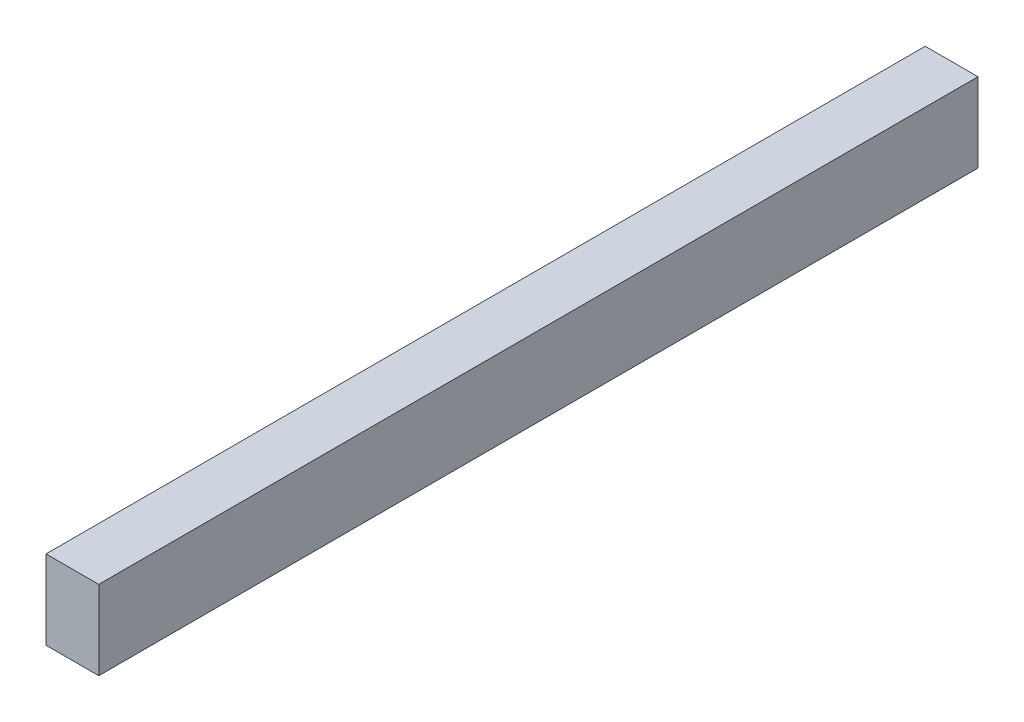
ISO-10303-21;
HEADER;
FILE_DESCRIPTION(('STEP AP214'),'2;1');
FILE_NAME('part.step','',(''),(''),'','','');
FILE_SCHEMA(('AUTOMOTIVE_DESIGN { 1 0 10303 214 1 1 1 1 }'));
ENDSEC;
DATA;
#1=APPLICATION_CONTEXT('core data for automotive mechanical design processes');
#2=APPLICATION_PROTOCOL_DEFINITION('international standard','automotive_design',2000,#1);
#3=PRODUCT_CONTEXT('',#1,'mechanical');
#4=PRODUCT('Part','Part','',(#3));
#5=PRODUCT_RELATED_PRODUCT_CATEGORY('part','',(#4));
#6=PRODUCT_DEFINITION_FORMATION('','',#4);
#7=PRODUCT_DEFINITION_CONTEXT('part definition',#1,'design');
#8=PRODUCT_DEFINITION('design','',#6,#7);
#9=PRODUCT_DEFINITION_SHAPE('','',#8);
#10=(LENGTH_UNIT() NAMED_UNIT(*) SI_UNIT(.MILLI.,.METRE.));
#11=(NAMED_UNIT(*) PLANE_ANGLE_UNIT() SI_UNIT($,.RADIAN.));
#12=(NAMED_UNIT(*) SI_UNIT($,.STERADIAN.) SOLID_ANGLE_UNIT());
#13=UNCERTAINTY_MEASURE_WITH_UNIT(LENGTH_MEASURE(1.E-05),#10,'distance_accuracy_value','');
#14=(GEOMETRIC_REPRESENTATION_CONTEXT(3) GLOBAL_UNCERTAINTY_ASSIGNED_CONTEXT((#13)) GLOBAL_UNIT_ASSIGNED_CONTEXT((#10,
#11,#12)) REPRESENTATION_CONTEXT('',''));
#15=CARTESIAN_POINT('',(0.,0.,0.));
#16=DIRECTION('',(0.,0.,1.));
#17=DIRECTION('',(1.,0.,0.));
#18=AXIS2_PLACEMENT_3D('',#15,#16,#17);
#19=CARTESIAN_POINT('',(-14.9999999999999,2.5,-162.));
#20=DIRECTION('',(0.,-1.,0.));
#21=DIRECTION('',(0.,0.,-1.));
#22=AXIS2_PLACEMENT_3D('',#19,#20,#21);
#23=CYLINDRICAL_SURFACE('',#22,5.);
#24=CARTESIAN_POINT('',(-12.1381823957492,2.5,-157.9));
#25=CARTESIAN_POINT('',(-12.0708784733394,2.42292574536293,-157.946962990163));
#26=CARTESIAN_POINT('',(-12.0067401079309,2.34325099460162,-157.994211563909));
#27=CARTESIAN_POINT('',(-11.8848870401686,2.17867129846748,-158.088226877804));
#28=CARTESIAN_POINT('',(-11.827180845484,2.09375965152346,-158.134992907265));
#29=CARTESIAN_POINT('',(-11.7177022854595,1.91765755359789,-158.227503096089));
#30=CARTESIAN_POINT('',(-11.6660240599136,1.82639596836984,-158.273223858516));
#31=CARTESIAN_POINT('',(-11.5699009779722,1.63875769578585,-158.361500183687));
#32=CARTESIAN_POINT('',(-11.525451955939,1.54238399691458,-158.404057561517));
#33=CARTESIAN_POINT('',(-11.4257121412985,1.29949677162919,-158.502666189578));
#34=CARTESIAN_POINT('',(-11.3746672136965,1.15009199597926,-158.556066470566));
#35=CARTESIAN_POINT('',(-11.2910402071132,0.84193067875827,-158.64627572746));
#36=CARTESIAN_POINT('',(-11.2583663584046,0.683225073430997,-158.683166979249));
#37=CARTESIAN_POINT('',(-11.2245683858408,0.439336075997338,-158.721830827077));
#38=CARTESIAN_POINT('',(-11.2158314471815,0.356461022243041,-158.731950816176));
#39=CARTESIAN_POINT('',(-11.2038233836229,0.189768890287721,-158.745904818135));
#40=CARTESIAN_POINT('',(-11.2005519684299,0.105951862356427,-158.749739164847));
#41=CARTESIAN_POINT('',(-11.199576406082,-0.0617786026982274,-158.750879997259));
#42=CARTESIAN_POINT('',(-11.2018735451402,-0.145692057619546,-158.748184974818));
#43=CARTESIAN_POINT('',(-11.2119639365722,-0.31271632563533,-158.736437962996));
#44=CARTESIAN_POINT('',(-11.2197570788317,-0.395827154776874,-158.727386100976));
#45=CARTESIAN_POINT('',(-11.2478144279695,-0.616952100780136,-158.695178225833));
#46=CARTESIAN_POINT('',(-11.2729641433331,-0.753591517545832,-158.666608640783));
#47=CARTESIAN_POINT('',(-11.3369127674698,-1.02012799081553,-158.596472135212));
#48=CARTESIAN_POINT('',(-11.3757267241793,-1.15001743209591,-158.554890891054));
#49=CARTESIAN_POINT('',(-11.4570490063879,-1.37813218583582,-158.471512973856));
#50=CARTESIAN_POINT('',(-11.4974613822835,-1.47769153298251,-158.431252094998));
#51=CARTESIAN_POINT('',(-11.5857695073914,-1.67164253579375,-158.346677213263));
#52=CARTESIAN_POINT('',(-11.633666965966,-1.76603300437985,-158.302362285527));
#53=CARTESIAN_POINT('',(-11.7366569334218,-1.94979729991697,-158.21115691132));
#54=CARTESIAN_POINT('',(-11.7917647432493,-2.03915986364502,-158.164261114246));
#55=CARTESIAN_POINT('',(-11.908811322132,-2.21257602808473,-158.069320271606));
#56=CARTESIAN_POINT('',(-11.9707490085806,-2.29663046687704,-158.021275409121));
#57=CARTESIAN_POINT('',(-12.170608022567,-2.54574346620994,-157.874181476933));
#58=CARTESIAN_POINT('',(-12.3194727646286,-2.70221218178033,-157.775056725459));
#59=CARTESIAN_POINT('',(-12.6444266964129,-2.98968483302918,-157.585632464764));
#60=CARTESIAN_POINT('',(-12.8204689988031,-3.12073176446786,-157.495318185372));
#61=CARTESIAN_POINT('',(-13.1650326158825,-3.33259121227965,-157.345797898776));
#62=CARTESIAN_POINT('',(-13.3293991535531,-3.41818755898359,-157.283914748017));
#63=CARTESIAN_POINT('',(-13.5871628566423,-3.52883305313963,-157.202913171285));
#64=CARTESIAN_POINT('',(-13.6749803715237,-3.56276403125759,-157.177877585166));
#65=CARTESIAN_POINT('',(-13.8539128417062,-3.62428204201829,-157.132249801536));
#66=CARTESIAN_POINT('',(-13.9450263091907,-3.65187189673112,-157.111655627661));
#67=CARTESIAN_POINT('',(-14.1306900769651,-3.70048372022256,-157.075234105442));
#68=CARTESIAN_POINT('',(-14.2252611747626,-3.72145438251234,-157.059444026884));
#69=CARTESIAN_POINT('',(-14.4164131972862,-3.7561756894332,-157.03323789539));
#70=CARTESIAN_POINT('',(-14.5129931392249,-3.76992978209437,-157.022819276047));
#71=CARTESIAN_POINT('',(-14.7073441781313,-3.78997273768479,-157.007620748027));
#72=CARTESIAN_POINT('',(-14.8051149795696,-3.79626341611731,-157.002839468046));
#73=CARTESIAN_POINT('',(-15.000955847889,-3.8012619360109,-156.999041134974));
#74=CARTESIAN_POINT('',(-15.0990258836063,-3.7999705418649,-157.000023500816));
#75=CARTESIAN_POINT('',(-15.283310971662,-3.79041449339656,-157.007281928578));
#76=CARTESIAN_POINT('',(-15.3695941509106,-3.78296763151737,-157.012937143185));
#77=CARTESIAN_POINT('',(-15.5410708447435,-3.76227519255664,-157.028614720888));
#78=CARTESIAN_POINT('',(-15.626263990541,-3.74902770371374,-157.038638523771));
#79=CARTESIAN_POINT('',(-15.8792794677526,-3.70084620017667,-157.074982475443));
#80=CARTESIAN_POINT('',(-16.0446937323576,-3.65746463381782,-157.107581810855));
#81=CARTESIAN_POINT('',(-16.3679766063841,-3.54940949810275,-157.187829863893));
#82=CARTESIAN_POINT('',(-16.525646099967,-3.48435269726075,-157.235748774848));
#83=CARTESIAN_POINT('',(-16.8276944058551,-3.33584579382316,-157.343258312708));
#84=CARTESIAN_POINT('',(-16.9720710309602,-3.25239267194886,-157.402850855356));
#85=CARTESIAN_POINT('',(-17.2681685400091,-3.05483134332434,-157.540606856881));
#86=CARTESIAN_POINT('',(-17.4173567307083,-2.93795353907155,-157.620215937423));
#87=CARTESIAN_POINT('',(-17.6953260696063,-2.685255049281,-157.785572370335));
#88=CARTESIAN_POINT('',(-17.8240685285669,-2.5493993436402,-157.871330924663));
#89=CARTESIAN_POINT('',(-18.0130145049048,-2.31825092782255,-158.00882748921));
#90=CARTESIAN_POINT('',(-18.0800659148557,-2.22840832812198,-158.060483611962));
#91=CARTESIAN_POINT('',(-18.2063098784865,-2.04259616595674,-158.162532436428));
#92=CARTESIAN_POINT('',(-18.2654997616261,-1.9466245377876,-158.212924704122));
#93=CARTESIAN_POINT('',(-18.3755827874151,-1.74878107052958,-158.310711033198));
#94=CARTESIAN_POINT('',(-18.4264879885828,-1.64691810468708,-158.358109389618));
#95=CARTESIAN_POINT('',(-18.5195700069724,-1.43728006104866,-158.447984972478));
#96=CARTESIAN_POINT('',(-18.5617528012334,-1.32950909621062,-158.490465559981));
#97=CARTESIAN_POINT('',(-18.6462449252602,-1.07998080535424,-158.578087433469));
#98=CARTESIAN_POINT('',(-18.6858658871708,-0.936542962330203,-158.621164709473));
#99=CARTESIAN_POINT('',(-18.7483225665975,-0.642330816214123,-158.690573795202));
#100=CARTESIAN_POINT('',(-18.771198582673,-0.491575063979682,-158.716945787286));
#101=CARTESIAN_POINT('',(-18.7986433065151,-0.184808197398411,-158.748722213304));
#102=CARTESIAN_POINT('',(-18.8030603353442,-0.0287641227969498,-158.753952916153));
#103=CARTESIAN_POINT('',(-18.7927259211736,0.281807958237344,-158.741892171779));
#104=CARTESIAN_POINT('',(-18.7779654014762,0.436335211875412,-158.724590059807));
#105=CARTESIAN_POINT('',(-18.7275583178342,0.758451175363782,-158.667299567864));
#106=CARTESIAN_POINT('',(-18.6894700099054,0.925164167241236,-158.624679974086));
#107=CARTESIAN_POINT('',(-18.5932540571273,1.24783645501811,-158.522442558473));
#108=CARTESIAN_POINT('',(-18.5350286192459,1.40373873064143,-158.46274203461));
#109=CARTESIAN_POINT('',(-18.4286276657215,1.64127180687407,-158.36028546522));
#110=CARTESIAN_POINT('',(-18.3862302088146,1.72698861103695,-158.320712045242));
#111=CARTESIAN_POINT('',(-18.2956006103763,1.89421794281773,-158.239319076243));
#112=CARTESIAN_POINT('',(-18.2473668521068,1.97572929650575,-158.197498906633));
#113=CARTESIAN_POINT('',(-18.1459387370976,2.13348533172392,-158.113180942793));
#114=CARTESIAN_POINT('',(-18.0928144499463,2.20978338493944,-158.070698300345));
#115=CARTESIAN_POINT('',(-17.9812655278952,2.35809932677708,-157.985401373279));
#116=CARTESIAN_POINT('',(-17.9228448592884,2.43012035251745,-157.942587358436));
#117=CARTESIAN_POINT('',(-17.8618176042508,2.5,-157.9));
#118=B_SPLINE_CURVE_WITH_KNOTS('',3,(#24,#25,#26,#27,#28,#29,#30,#31,#32,#33,#34,#35,#36,#37,
#38,#39,#40,#41,#42,#43,#44,#45,#46,#47,#48,#49,#50,#51,#52,#53,#54,#55,#56,#57,#58,#59,#60,#61,
#62,#63,#64,#65,#66,#67,#68,#69,#70,#71,#72,#73,#74,#75,#76,#77,#78,#79,#80,#81,#82,#83,#84,#85,
#86,#87,#88,#89,#90,#91,#92,#93,#94,#95,#96,#97,#98,#99,#100,#101,#102,#103,#104,#105,#106,#107,
#108,#109,#110,#111,#112,#113,#114,#115,#116,#117),.UNSPECIFIED.,.F.,.F.,(4,2,2,2,2,2,2,2,2,2,2,
2,2,2,2,2,2,2,2,2,2,2,2,2,2,2,2,2,2,2,2,2,2,2,2,2,2,2,2,2,2,2,2,2,2,2,4),(0.,0.33769590663108,
0.675833303601331,1.01869368261242,1.36135579200632,1.85966047082445,2.35545331667111,
2.60693059217482,2.85839451038528,3.10991651674096,3.36143348390593,3.78517886221006,
4.2093923633841,4.55317021675882,4.89702669345394,5.24162506898137,5.5861689003856,
6.29596693176579,7.00455381316619,7.58809953314123,7.88004303738517,8.17185636165337,
8.46587898675455,8.7597610015327,9.05357151375104,9.34735240572761,9.60739743788224,
9.86752823984814,10.3873269428743,10.9168522540549,11.4464645378658,12.0609745300507,
12.6766338427089,13.0465871960023,13.4166659018176,13.7862010378291,14.1554821041006,
14.6185439650254,15.0804877192925,15.5462199272906,16.0121726457885,16.5380443639965,
17.0665066196002,17.3767525576476,17.6870846358167,17.9935111301659,18.2997100175654),.UNSPECIFIED.);
#119=CARTESIAN_POINT('',(-16.4798648586949,-3.5,-157.224018425496));
#120=VERTEX_POINT('',#119);
#121=CARTESIAN_POINT('',(-17.8618176042508,2.5,-157.9));
#122=VERTEX_POINT('',#121);
#123=EDGE_CURVE('E347',#120,#122,#118,.T.);
#124=ORIENTED_EDGE('',*,*,#123,.F.);
#125=CARTESIAN_POINT('',(-14.9999999999999,-3.5,-162.));
#126=DIRECTION('',(0.,1.,0.));
#127=DIRECTION('',(0.,0.,1.));
#128=AXIS2_PLACEMENT_3D('',#125,#126,#127);
#129=CIRCLE('',#128,5.);
#130=CARTESIAN_POINT('',(-16.4798648586949,-3.5,-166.775981574504));
#131=VERTEX_POINT('',#130);
#132=EDGE_CURVE('E11',#120,#131,#129,.F.);
#133=ORIENTED_EDGE('',*,*,#132,.T.);
#134=CARTESIAN_POINT('',(-17.8618176042508,2.5,-166.1));
#135=CARTESIAN_POINT('',(-17.9291215266606,2.42292574536292,-166.053037009837));
#136=CARTESIAN_POINT('',(-17.9932598920691,2.34325099460161,-166.005788436091));
#137=CARTESIAN_POINT('',(-18.1151129598314,2.17867129846746,-165.911773122196));
#138=CARTESIAN_POINT('',(-18.172819154516,2.09375965152345,-165.865007092734));
#139=CARTESIAN_POINT('',(-18.2822977145405,1.91765755359788,-165.772496903911));
#140=CARTESIAN_POINT('',(-18.3339759400865,1.82639596836982,-165.726776141484));
#141=CARTESIAN_POINT('',(-18.4300990220278,1.63875769578584,-165.638499816312));
#142=CARTESIAN_POINT('',(-18.474548044061,1.54238399691457,-165.595942438483));
#143=CARTESIAN_POINT('',(-18.5742878587015,1.29949677162918,-165.497333810422));
#144=CARTESIAN_POINT('',(-18.6253327863035,1.15009199597926,-165.443933529433));
#145=CARTESIAN_POINT('',(-18.7089597928868,0.841930678758282,-165.353724272539));
#146=CARTESIAN_POINT('',(-18.7416336415954,0.683225073431015,-165.31683302075));
#147=CARTESIAN_POINT('',(-18.7754316141592,0.439336075997363,-165.278169172923));
#148=CARTESIAN_POINT('',(-18.7841685528185,0.356461022243068,-165.268049183823));
#149=CARTESIAN_POINT('',(-18.7961766163771,0.189768890287752,-165.254095181865));
#150=CARTESIAN_POINT('',(-18.7994480315701,0.105951862356461,-165.250260835152));
#151=CARTESIAN_POINT('',(-18.800423593918,-0.0617786026981866,-165.249120002741));
#152=CARTESIAN_POINT('',(-18.7981264548598,-0.145692057619502,-165.251815025182));
#153=CARTESIAN_POINT('',(-18.7880360634278,-0.312716325635282,-165.263562037004));
#154=CARTESIAN_POINT('',(-18.7802429211683,-0.395827154776824,-165.272613899023));
#155=CARTESIAN_POINT('',(-18.7521855720305,-0.616952100780078,-165.304821774166));
#156=CARTESIAN_POINT('',(-18.7270358566669,-0.753591517545763,-165.333391359217));
#157=CARTESIAN_POINT('',(-18.6630872325302,-1.02012799081546,-165.403527864788));
#158=CARTESIAN_POINT('',(-18.6242732758207,-1.15001743209583,-165.445109108946));
#159=CARTESIAN_POINT('',(-18.5429509936122,-1.37813218583574,-165.528487026143));
#160=CARTESIAN_POINT('',(-18.5025386177165,-1.47769153298242,-165.568747905002));
#161=CARTESIAN_POINT('',(-18.4142304926087,-1.67164253579367,-165.653322786736));
#162=CARTESIAN_POINT('',(-18.366333034034,-1.76603300437977,-165.697637714472));
#163=CARTESIAN_POINT('',(-18.2633430665783,-1.94979729991688,-165.78884308868));
#164=CARTESIAN_POINT('',(-18.2082352567507,-2.03915986364493,-165.835738885753));
#165=CARTESIAN_POINT('',(-18.0911886778681,-2.21257602808463,-165.930679728393));
#166=CARTESIAN_POINT('',(-18.0292509914195,-2.29663046687693,-165.978724590878));
#167=CARTESIAN_POINT('',(-17.829391977433,-2.54574346620985,-166.125818523067));
#168=CARTESIAN_POINT('',(-17.6805272353715,-2.70221218178024,-166.224943274541));
#169=CARTESIAN_POINT('',(-17.3555733035872,-2.9896848330291,-166.414367535235));
#170=CARTESIAN_POINT('',(-17.179531001197,-3.12073176446778,-166.504681814628));
#171=CARTESIAN_POINT('',(-16.8349673841176,-3.33259121227958,-166.654202101224));
#172=CARTESIAN_POINT('',(-16.670600846447,-3.41818755898353,-166.716085251982));
#173=CARTESIAN_POINT('',(-16.4128371433578,-3.52883305313959,-166.797086828714));
#174=CARTESIAN_POINT('',(-16.3250196284764,-3.56276403125755,-166.822122414834));
#175=CARTESIAN_POINT('',(-16.1460871582939,-3.62428204201825,-166.867750198464));
#176=CARTESIAN_POINT('',(-16.0549736908094,-3.65187189673108,-166.888344372339));
#177=CARTESIAN_POINT('',(-15.869309923035,-3.70048372022253,-166.924765894557));
#178=CARTESIAN_POINT('',(-15.7747388252375,-3.72145438251232,-166.940555973116));
#179=CARTESIAN_POINT('',(-15.5835868027139,-3.75617568943318,-166.96676210461));
#180=CARTESIAN_POINT('',(-15.4870068607752,-3.76992978209436,-166.977180723952));
#181=CARTESIAN_POINT('',(-15.2926558218688,-3.78997273768479,-166.992379251973));
#182=CARTESIAN_POINT('',(-15.1948850204305,-3.7962634161173,-166.997160531953));
#183=CARTESIAN_POINT('',(-14.9990441521111,-3.8012619360109,-167.000958865025));
#184=CARTESIAN_POINT('',(-14.9009741163938,-3.7999705418649,-166.999976499184));
#185=CARTESIAN_POINT('',(-14.7166890283381,-3.79041449339656,-166.992718071422));
#186=CARTESIAN_POINT('',(-14.6304058490895,-3.78296763151738,-166.987062856815));
#187=CARTESIAN_POINT('',(-14.4589291552565,-3.76227519255665,-166.971385279112));
#188=CARTESIAN_POINT('',(-14.3737360094591,-3.74902770371375,-166.961361476229));
#189=CARTESIAN_POINT('',(-14.1207205322475,-3.70084620017668,-166.925017524556));
#190=CARTESIAN_POINT('',(-13.9553062676425,-3.65746463381783,-166.892418189144));
#191=CARTESIAN_POINT('',(-13.632023393616,-3.54940949810278,-166.812170136107));
#192=CARTESIAN_POINT('',(-13.4743539000331,-3.48435269726078,-166.764251225151));
#193=CARTESIAN_POINT('',(-13.172305594145,-3.3358457938232,-166.656741687292));
#194=CARTESIAN_POINT('',(-13.0279289690399,-3.2523926719489,-166.597149144644));
#195=CARTESIAN_POINT('',(-12.7318314599909,-3.05483134332438,-166.459393143118));
#196=CARTESIAN_POINT('',(-12.5826432692918,-2.93795353907159,-166.379784062576));
#197=CARTESIAN_POINT('',(-12.3046739303938,-2.68525504928106,-166.214427629665));
#198=CARTESIAN_POINT('',(-12.1759314714331,-2.54939934364026,-166.128669075336));
#199=CARTESIAN_POINT('',(-11.9869854950952,-2.31825092782262,-165.99117251079));
#200=CARTESIAN_POINT('',(-11.9199340851443,-2.22840832812205,-165.939516388037));
#201=CARTESIAN_POINT('',(-11.7936901215135,-2.04259616595683,-165.837467563571));
#202=CARTESIAN_POINT('',(-11.734500238374,-1.94662453778769,-165.787075295878));
#203=CARTESIAN_POINT('',(-11.624417212585,-1.74878107052968,-165.689288966801));
#204=CARTESIAN_POINT('',(-11.5735120114172,-1.64691810468718,-165.641890610382));
#205=CARTESIAN_POINT('',(-11.4804299930277,-1.43728006104876,-165.552015027521));
#206=CARTESIAN_POINT('',(-11.4382471987667,-1.32950909621073,-165.509534440018));
#207=CARTESIAN_POINT('',(-11.3537550747398,-1.07998080535433,-165.421912566531));
#208=CARTESIAN_POINT('',(-11.3141341128293,-0.936542962330287,-165.378835290527));
#209=CARTESIAN_POINT('',(-11.2516774334025,-0.642330816214196,-165.309426204798));
#210=CARTESIAN_POINT('',(-11.228801417327,-0.491575063979752,-165.283054212714));
#211=CARTESIAN_POINT('',(-11.2013566934849,-0.184808197398473,-165.251277786695));
#212=CARTESIAN_POINT('',(-11.1969396646558,-0.0287641227970052,-165.246047083846));
#213=CARTESIAN_POINT('',(-11.2072740788264,0.281807958237304,-165.258107828221));
#214=CARTESIAN_POINT('',(-11.2220345985238,0.436335211875381,-165.275409940192));
#215=CARTESIAN_POINT('',(-11.2724416821658,0.758451175363762,-165.332700432136));
#216=CARTESIAN_POINT('',(-11.3105299900946,0.925164167241218,-165.375320025914));
#217=CARTESIAN_POINT('',(-11.4067459428727,1.24783645501809,-165.477557441527));
#218=CARTESIAN_POINT('',(-11.4649713807541,1.40373873064142,-165.53725796539));
#219=CARTESIAN_POINT('',(-11.5713723342785,1.64127180687405,-165.63971453478));
#220=CARTESIAN_POINT('',(-11.6137697911854,1.72698861103694,-165.679287954758));
#221=CARTESIAN_POINT('',(-11.7043993896237,1.89421794281771,-165.760680923756));
#222=CARTESIAN_POINT('',(-11.7526331478932,1.97572929650573,-165.802501093367));
#223=CARTESIAN_POINT('',(-11.8540612629024,2.13348533172391,-165.886819057207));
#224=CARTESIAN_POINT('',(-11.9071855500536,2.20978338493943,-165.929301699654));
#225=CARTESIAN_POINT('',(-12.0187344721048,2.35809932677707,-166.01459862672));
#226=CARTESIAN_POINT('',(-12.0771551407116,2.43012035251744,-166.057412641564));
#227=CARTESIAN_POINT('',(-12.1381823957492,2.49999999999999,-166.1));
#228=B_SPLINE_CURVE_WITH_KNOTS('',3,(#134,#135,#136,#137,#138,#139,#140,#141,#142,#143,#144,
#145,#146,#147,#148,#149,#150,#151,#152,#153,#154,#155,#156,#157,#158,#159,#160,#161,#162,#163,
#164,#165,#166,#167,#168,#169,#170,#171,#172,#173,#174,#175,#176,#177,#178,#179,#180,#181,#182,
#183,#184,#185,#186,#187,#188,#189,#190,#191,#192,#193,#194,#195,#196,#197,#198,#199,#200,#201,
#202,#203,#204,#205,#206,#207,#208,#209,#210,#211,#212,#213,#214,#215,#216,#217,#218,#219,#220,
#221,#222,#223,#224,#225,#226,#227),.UNSPECIFIED.,.F.,.F.,(4,2,2,2,2,2,2,2,2,2,2,2,2,2,2,2,2,2,
2,2,2,2,2,2,2,2,2,2,2,2,2,2,2,2,2,2,2,2,2,2,2,2,2,2,2,2,4),(0.,0.337695906631104,
0.675833303601369,1.01869368261245,1.36135579200635,1.85966047082447,2.35545331667111,
2.60693059217482,2.85839451038527,3.10991651674094,3.3614334839059,3.78517886221,
4.20939236338405,4.55317021675877,4.89702669345387,5.24162506898127,5.5861689003855,
6.29596693176569,7.00455381316609,7.58809953314116,7.88004303738511,8.17185636165331,
8.46587898675451,8.75976100153266,9.05357151375101,9.34735240572759,9.60739743788223,
9.86752823984813,10.3873269428743,10.9168522540549,11.4464645378657,12.0609745300507,
12.6766338427089,13.0465871960023,13.4166659018175,13.786201037829,14.1554821041005,
14.6185439650253,15.0804877192925,15.5462199272906,16.0121726457885,16.5380443639965,
17.0665066196002,17.3767525576476,17.6870846358167,17.993511130166,18.2997100175654),.UNSPECIFIED.);
#229=CARTESIAN_POINT('',(-17.8618176042508,2.5,-166.1));
#230=VERTEX_POINT('',#229);
#231=EDGE_CURVE('E337',#230,#131,#228,.T.);
#232=ORIENTED_EDGE('',*,*,#231,.F.);
#233=CARTESIAN_POINT('',(-14.9999999999999,2.5,-162.));
#234=DIRECTION('',(0.,-1.,0.));
#235=DIRECTION('',(0.,0.,-1.));
#236=AXIS2_PLACEMENT_3D('',#233,#234,#235);
#237=CIRCLE('',#236,5.);
#238=EDGE_CURVE('E233',#122,#230,#237,.T.);
#239=ORIENTED_EDGE('',*,*,#238,.F.);
#240=EDGE_LOOP('',(#124,#133,#232,#239));
#241=FACE_BOUND('',#240,.T.);
#242=ADVANCED_FACE('F38',(#241),#23,.F.);
#243=CARTESIAN_POINT('',(-15.,0.,-155.));
#244=DIRECTION('',(0.,0.,-1.));
#245=DIRECTION('',(-1.,0.,0.));
#246=AXIS2_PLACEMENT_3D('',#243,#244,#245);
#247=CYLINDRICAL_SURFACE('',#246,3.8);
#248=CARTESIAN_POINT('',(-15.,0.,-250.));
#249=DIRECTION('',(0.,0.,-1.));
#250=DIRECTION('',(-1.,0.,0.));
#251=AXIS2_PLACEMENT_3D('',#248,#249,#250);
#252=CIRCLE('',#251,3.8);
#253=CARTESIAN_POINT('',(-18.8,0.,-250.));
#254=VERTEX_POINT('',#253);
#255=EDGE_CURVE('E236',#254,#254,#252,.T.);
#256=ORIENTED_EDGE('',*,*,#255,.T.);
#257=EDGE_LOOP('',(#256));
#258=FACE_BOUND('',#257,.T.);
#259=CARTESIAN_POINT('',(-15.,0.,-155.));
#260=DIRECTION('',(0.,0.,-1.));
#261=DIRECTION('',(-1.,0.,0.));
#262=AXIS2_PLACEMENT_3D('',#259,#260,#261);
#263=CIRCLE('',#262,3.8);
#264=CARTESIAN_POINT('',(-18.8,0.,-155.));
#265=VERTEX_POINT('',#264);
#266=EDGE_CURVE('E237',#265,#265,#263,.T.);
#267=ORIENTED_EDGE('',*,*,#266,.F.);
#268=EDGE_LOOP('',(#267));
#269=FACE_BOUND('',#268,.T.);
#270=CARTESIAN_POINT('',(-12.1381823957492,2.5,-157.9));
#271=VERTEX_POINT('',#270);
#272=CARTESIAN_POINT('',(-13.5201351413051,-3.5,-157.224018425496));
#273=VERTEX_POINT('',#272);
#274=EDGE_CURVE('E348',#271,#273,#118,.T.);
#275=ORIENTED_EDGE('',*,*,#274,.T.);
#276=DIRECTION('',(0.,0.,-1.));
#277=VECTOR('',#276,1.);
#278=CARTESIAN_POINT('',(-13.5201351413051,-3.5,-155.));
#279=LINE('',#278,#277);
#280=CARTESIAN_POINT('',(-13.5201351413051,-3.5,-157.));
#281=VERTEX_POINT('',#280);
#282=EDGE_CURVE('E54',#273,#281,#279,.F.);
#283=ORIENTED_EDGE('',*,*,#282,.T.);
#284=CARTESIAN_POINT('',(-15.,0.,-157.));
#285=DIRECTION('',(0.,0.,1.));
#286=DIRECTION('',(1.,0.,0.));
#287=AXIS2_PLACEMENT_3D('',#284,#285,#286);
#288=CIRCLE('',#287,3.8);
#289=CARTESIAN_POINT('',(-16.4798648586949,-3.5,-157.));
#290=VERTEX_POINT('',#289);
#291=EDGE_CURVE('E182',#281,#290,#288,.F.);
#292=ORIENTED_EDGE('',*,*,#291,.T.);
#293=DIRECTION('',(0.,0.,-1.));
#294=VECTOR('',#293,1.);
#295=CARTESIAN_POINT('',(-16.4798648586949,-3.5,-155.));
#296=LINE('',#295,#294);
#297=EDGE_CURVE('E227',#290,#120,#296,.T.);
#298=ORIENTED_EDGE('',*,*,#297,.T.);
#299=ORIENTED_EDGE('',*,*,#123,.T.);
#300=DIRECTION('',(0.,0.,-1.));
#301=VECTOR('',#300,1.);
#302=CARTESIAN_POINT('',(-17.8618176042508,2.5,-155.));
#303=LINE('',#302,#301);
#304=EDGE_CURVE('E392',#230,#122,#303,.F.);
#305=ORIENTED_EDGE('',*,*,#304,.F.);
#306=ORIENTED_EDGE('',*,*,#231,.T.);
#307=CARTESIAN_POINT('',(-16.4798648586949,-3.5,-167.));
#308=VERTEX_POINT('',#307);
#309=EDGE_CURVE('E223',#131,#308,#296,.T.);
#310=ORIENTED_EDGE('',*,*,#309,.T.);
#311=CARTESIAN_POINT('',(-15.,0.,-167.));
#312=DIRECTION('',(0.,0.,-1.));
#313=DIRECTION('',(-1.,0.,0.));
#314=AXIS2_PLACEMENT_3D('',#311,#312,#313);
#315=CIRCLE('',#314,3.8);
#316=CARTESIAN_POINT('',(-13.5201351413051,-3.5,-167.));
#317=VERTEX_POINT('',#316);
#318=EDGE_CURVE('E230',#308,#317,#315,.F.);
#319=ORIENTED_EDGE('',*,*,#318,.T.);
#320=CARTESIAN_POINT('',(-13.5201351413051,-3.5,-166.775981574504));
#321=VERTEX_POINT('',#320);
#322=EDGE_CURVE('E222',#317,#321,#279,.F.);
#323=ORIENTED_EDGE('',*,*,#322,.T.);
#324=CARTESIAN_POINT('',(-12.1381823957492,2.5,-166.1));
#325=VERTEX_POINT('',#324);
#326=EDGE_CURVE('E336',#321,#325,#228,.T.);
#327=ORIENTED_EDGE('',*,*,#326,.T.);
#328=DIRECTION('',(0.,0.,-1.));
#329=VECTOR('',#328,1.);
#330=CARTESIAN_POINT('',(-12.1381823957492,2.5,-155.));
#331=LINE('',#330,#329);
#332=EDGE_CURVE('E325',#271,#325,#331,.T.);
#333=ORIENTED_EDGE('',*,*,#332,.F.);
#334=EDGE_LOOP('',(#275,#283,#292,#298,#299,#305,#306,#310,#319,#323,#327,#333));
#335=FACE_BOUND('',#334,.T.);
#336=ADVANCED_FACE('F353',(#258,#269,#335),#247,.F.);
#337=CARTESIAN_POINT('',(-30.,-22.5,-250.));
#338=DIRECTION('',(0.,0.,-1.));
#339=DIRECTION('',(-1.,0.,0.));
#340=AXIS2_PLACEMENT_3D('',#337,#338,#339);
#341=PLANE('',#340);
#342=ORIENTED_EDGE('',*,*,#255,.F.);
#343=EDGE_LOOP('',(#342));
#344=FACE_BOUND('',#343,.T.);
#345=DIRECTION('',(0.,1.,0.));
#346=VECTOR('',#345,1.);
#347=CARTESIAN_POINT('',(0.,-22.5,-250.));
#348=LINE('',#347,#346);
#349=CARTESIAN_POINT('',(0.,-22.5,-250.));
#350=VERTEX_POINT('',#349);
#351=CARTESIAN_POINT('',(0.,22.5,-250.));
#352=VERTEX_POINT('',#351);
#353=EDGE_CURVE('E280',#350,#352,#348,.T.);
#354=ORIENTED_EDGE('',*,*,#353,.F.);
#355=DIRECTION('',(1.,0.,0.));
#356=VECTOR('',#355,1.);
#357=CARTESIAN_POINT('',(-30.,-22.5,-250.));
#358=LINE('',#357,#356);
#359=CARTESIAN_POINT('',(-30.,-22.5,-250.));
#360=VERTEX_POINT('',#359);
#361=EDGE_CURVE('E322',#360,#350,#358,.T.);
#362=ORIENTED_EDGE('',*,*,#361,.F.);
#363=DIRECTION('',(0.,1.,0.));
#364=VECTOR('',#363,1.);
#365=CARTESIAN_POINT('',(-30.,-22.5,-250.));
#366=LINE('',#365,#364);
#367=CARTESIAN_POINT('',(-30.,22.5,-250.));
#368=VERTEX_POINT('',#367);
#369=EDGE_CURVE('E290',#360,#368,#366,.T.);
#370=ORIENTED_EDGE('',*,*,#369,.T.);
#371=DIRECTION('',(1.,0.,0.));
#372=VECTOR('',#371,1.);
#373=CARTESIAN_POINT('',(-30.,22.5,-250.));
#374=LINE('',#373,#372);
#375=EDGE_CURVE('E307',#368,#352,#374,.T.);
#376=ORIENTED_EDGE('',*,*,#375,.T.);
#377=EDGE_LOOP('',(#354,#362,#370,#376));
#378=FACE_BOUND('',#377,.T.);
#379=ADVANCED_FACE('F40',(#344,#378),#341,.T.);
#380=CARTESIAN_POINT('',(-30.,-22.5,250.));
#381=DIRECTION('',(0.,-1.,0.));
#382=DIRECTION('',(0.,0.,-1.));
#383=AXIS2_PLACEMENT_3D('',#380,#381,#382);
#384=PLANE('',#383);
#385=DIRECTION('',(0.,0.,-1.));
#386=VECTOR('',#385,1.);
#387=CARTESIAN_POINT('',(-23.,-22.5,243.));
#388=LINE('',#387,#386);
#389=CARTESIAN_POINT('',(-23.,-22.5,243.));
#390=VERTEX_POINT('',#389);
#391=CARTESIAN_POINT('',(-23.,-22.5,-167.));
#392=VERTEX_POINT('',#391);
#393=EDGE_CURVE('E241',#390,#392,#388,.T.);
#394=ORIENTED_EDGE('',*,*,#393,.F.);
#395=DIRECTION('',(-1.,0.,0.));
#396=VECTOR('',#395,1.);
#397=CARTESIAN_POINT('',(-23.,-22.5,243.));
#398=LINE('',#397,#396);
#399=CARTESIAN_POINT('',(-7.,-22.5,243.));
#400=VERTEX_POINT('',#399);
#401=EDGE_CURVE('E250',#400,#390,#398,.T.);
#402=ORIENTED_EDGE('',*,*,#401,.F.);
#403=DIRECTION('',(0.,0.,1.));
#404=VECTOR('',#403,1.);
#405=CARTESIAN_POINT('',(-7.,-22.5,243.));
#406=LINE('',#405,#404);
#407=CARTESIAN_POINT('',(-6.99999999999995,-22.5,-167.));
#408=VERTEX_POINT('',#407);
#409=EDGE_CURVE('E270',#408,#400,#406,.T.);
#410=ORIENTED_EDGE('',*,*,#409,.F.);
#411=DIRECTION('',(1.,0.,0.));
#412=VECTOR('',#411,1.);
#413=CARTESIAN_POINT('',(-23.,-22.5,-167.));
#414=LINE('',#413,#412);
#415=EDGE_CURVE('E266',#392,#408,#414,.T.);
#416=ORIENTED_EDGE('',*,*,#415,.F.);
#417=EDGE_LOOP('',(#394,#402,#410,#416));
#418=FACE_BOUND('',#417,.T.);
#419=DIRECTION('',(0.,0.,-1.));
#420=VECTOR('',#419,1.);
#421=CARTESIAN_POINT('',(0.,-22.5,250.));
#422=LINE('',#421,#420);
#423=CARTESIAN_POINT('',(0.,-22.5,250.));
#424=VERTEX_POINT('',#423);
#425=EDGE_CURVE('E295',#424,#350,#422,.T.);
#426=ORIENTED_EDGE('',*,*,#425,.F.);
#427=DIRECTION('',(1.,0.,0.));
#428=VECTOR('',#427,1.);
#429=CARTESIAN_POINT('',(-30.,-22.5,250.));
#430=LINE('',#429,#428);
#431=CARTESIAN_POINT('',(-30.,-22.5,250.));
#432=VERTEX_POINT('',#431);
#433=EDGE_CURVE('E326',#432,#424,#430,.T.);
#434=ORIENTED_EDGE('',*,*,#433,.F.);
#435=DIRECTION('',(0.,0.,-1.));
#436=VECTOR('',#435,1.);
#437=CARTESIAN_POINT('',(-30.,-22.5,250.));
#438=LINE('',#437,#436);
#439=EDGE_CURVE('E303',#432,#360,#438,.T.);
#440=ORIENTED_EDGE('',*,*,#439,.T.);
#441=ORIENTED_EDGE('',*,*,#361,.T.);
#442=EDGE_LOOP('',(#426,#434,#440,#441));
#443=FACE_BOUND('',#442,.T.);
#444=ADVANCED_FACE('F508',(#418,#443),#384,.T.);
#445=CARTESIAN_POINT('',(-30.,-22.5,250.));
#446=DIRECTION('',(0.,0.,1.));
#447=DIRECTION('',(1.,0.,0.));
#448=AXIS2_PLACEMENT_3D('',#445,#446,#447);
#449=PLANE('',#448);
#450=DIRECTION('',(0.,-1.,0.));
#451=VECTOR('',#450,1.);
#452=CARTESIAN_POINT('',(0.,-22.5,250.));
#453=LINE('',#452,#451);
#454=CARTESIAN_POINT('',(0.,22.5,250.));
#455=VERTEX_POINT('',#454);
#456=EDGE_CURVE('E315',#455,#424,#453,.T.);
#457=ORIENTED_EDGE('',*,*,#456,.F.);
#458=DIRECTION('',(1.,0.,0.));
#459=VECTOR('',#458,1.);
#460=CARTESIAN_POINT('',(-30.,22.5,250.));
#461=LINE('',#460,#459);
#462=CARTESIAN_POINT('',(-30.,22.5,250.));
#463=VERTEX_POINT('',#462);
#464=EDGE_CURVE('E329',#463,#455,#461,.T.);
#465=ORIENTED_EDGE('',*,*,#464,.F.);
#466=DIRECTION('',(0.,-1.,0.));
#467=VECTOR('',#466,1.);
#468=CARTESIAN_POINT('',(-30.,-22.5,250.));
#469=LINE('',#468,#467);
#470=EDGE_CURVE('E299',#463,#432,#469,.T.);
#471=ORIENTED_EDGE('',*,*,#470,.T.);
#472=ORIENTED_EDGE('',*,*,#433,.T.);
#473=EDGE_LOOP('',(#457,#465,#471,#472));
#474=FACE_BOUND('',#473,.T.);
#475=ADVANCED_FACE('F542',(#474),#449,.T.);
#476=CARTESIAN_POINT('',(-30.,22.5,250.));
#477=DIRECTION('',(0.,1.,0.));
#478=DIRECTION('',(0.,0.,1.));
#479=AXIS2_PLACEMENT_3D('',#476,#477,#478);
#480=PLANE('',#479);
#481=DIRECTION('',(0.,0.,1.));
#482=VECTOR('',#481,1.);
#483=CARTESIAN_POINT('',(0.,22.5,250.));
#484=LINE('',#483,#482);
#485=EDGE_CURVE('E311',#352,#455,#484,.T.);
#486=ORIENTED_EDGE('',*,*,#485,.F.);
#487=ORIENTED_EDGE('',*,*,#375,.F.);
#488=DIRECTION('',(0.,0.,1.));
#489=VECTOR('',#488,1.);
#490=CARTESIAN_POINT('',(-30.,22.5,250.));
#491=LINE('',#490,#489);
#492=EDGE_CURVE('E294',#368,#463,#491,.T.);
#493=ORIENTED_EDGE('',*,*,#492,.T.);
#494=ORIENTED_EDGE('',*,*,#464,.T.);
#495=EDGE_LOOP('',(#486,#487,#493,#494));
#496=FACE_BOUND('',#495,.T.);
#497=ADVANCED_FACE('F562',(#496),#480,.T.);
#498=CARTESIAN_POINT('',(-30.,0.,0.));
#499=DIRECTION('',(-1.,0.,0.));
#500=DIRECTION('',(0.,0.,1.));
#501=AXIS2_PLACEMENT_3D('',#498,#499,#500);
#502=PLANE('',#501);
#503=ORIENTED_EDGE('',*,*,#369,.F.);
#504=ORIENTED_EDGE('',*,*,#439,.F.);
#505=ORIENTED_EDGE('',*,*,#470,.F.);
#506=ORIENTED_EDGE('',*,*,#492,.F.);
#507=EDGE_LOOP('',(#503,#504,#505,#506));
#508=FACE_BOUND('',#507,.T.);
#509=ADVANCED_FACE('F552',(#508),#502,.T.);
#510=CARTESIAN_POINT('',(0.,0.,0.));
#511=DIRECTION('',(-1.,0.,0.));
#512=DIRECTION('',(0.,0.,1.));
#513=AXIS2_PLACEMENT_3D('',#510,#511,#512);
#514=PLANE('',#513);
#515=ORIENTED_EDGE('',*,*,#353,.T.);
#516=ORIENTED_EDGE('',*,*,#485,.T.);
#517=ORIENTED_EDGE('',*,*,#456,.T.);
#518=ORIENTED_EDGE('',*,*,#425,.T.);
#519=EDGE_LOOP('',(#515,#516,#517,#518));
#520=FACE_BOUND('',#519,.T.);
#521=ADVANCED_FACE('F532',(#520),#514,.F.);
#522=CARTESIAN_POINT('',(-23.,-9.5,243.));
#523=DIRECTION('',(-1.,0.,0.));
#524=DIRECTION('',(0.,0.,1.));
#525=AXIS2_PLACEMENT_3D('',#522,#523,#524);
#526=PLANE('',#525);
#527=ORIENTED_EDGE('',*,*,#393,.T.);
#528=DIRECTION('',(0.,-1.,0.));
#529=VECTOR('',#528,1.);
#530=CARTESIAN_POINT('',(-23.,-9.5,-167.));
#531=LINE('',#530,#529);
#532=CARTESIAN_POINT('',(-23.,-9.5,-167.));
#533=VERTEX_POINT('',#532);
#534=EDGE_CURVE('E263',#533,#392,#531,.T.);
#535=ORIENTED_EDGE('',*,*,#534,.F.);
#536=DIRECTION('',(0.,0.,-1.));
#537=VECTOR('',#536,1.);
#538=CARTESIAN_POINT('',(-23.,-9.5,243.));
#539=LINE('',#538,#537);
#540=CARTESIAN_POINT('',(-23.,-9.5,243.));
#541=VERTEX_POINT('',#540);
#542=EDGE_CURVE('E245',#541,#533,#539,.T.);
#543=ORIENTED_EDGE('',*,*,#542,.F.);
#544=DIRECTION('',(0.,-1.,0.));
#545=VECTOR('',#544,1.);
#546=CARTESIAN_POINT('',(-23.,-9.5,243.));
#547=LINE('',#546,#545);
#548=EDGE_CURVE('E277',#541,#390,#547,.T.);
#549=ORIENTED_EDGE('',*,*,#548,.T.);
#550=EDGE_LOOP('',(#527,#535,#543,#549));
#551=FACE_BOUND('',#550,.T.);
#552=ADVANCED_FACE('F422',(#551),#526,.F.);
#553=CARTESIAN_POINT('',(-23.,-9.5,243.));
#554=DIRECTION('',(0.,0.,1.));
#555=DIRECTION('',(1.,0.,0.));
#556=AXIS2_PLACEMENT_3D('',#553,#554,#555);
#557=PLANE('',#556);
#558=ORIENTED_EDGE('',*,*,#401,.T.);
#559=ORIENTED_EDGE('',*,*,#548,.F.);
#560=DIRECTION('',(-1.,0.,0.));
#561=VECTOR('',#560,1.);
#562=CARTESIAN_POINT('',(-23.,-9.5,243.));
#563=LINE('',#562,#561);
#564=CARTESIAN_POINT('',(-7.,-9.5,243.));
#565=VERTEX_POINT('',#564);
#566=EDGE_CURVE('E259',#565,#541,#563,.T.);
#567=ORIENTED_EDGE('',*,*,#566,.F.);
#568=DIRECTION('',(0.,-1.,0.));
#569=VECTOR('',#568,1.);
#570=CARTESIAN_POINT('',(-7.,-9.5,243.));
#571=LINE('',#570,#569);
#572=EDGE_CURVE('E281',#565,#400,#571,.T.);
#573=ORIENTED_EDGE('',*,*,#572,.T.);
#574=EDGE_LOOP('',(#558,#559,#567,#573));
#575=FACE_BOUND('',#574,.T.);
#576=ADVANCED_FACE('F416',(#575),#557,.F.);
#577=CARTESIAN_POINT('',(-7.,-9.5,243.));
#578=DIRECTION('',(1.,0.,0.));
#579=DIRECTION('',(0.,0.,-1.));
#580=AXIS2_PLACEMENT_3D('',#577,#578,#579);
#581=PLANE('',#580);
#582=ORIENTED_EDGE('',*,*,#409,.T.);
#583=ORIENTED_EDGE('',*,*,#572,.F.);
#584=DIRECTION('',(0.,0.,1.));
#585=VECTOR('',#584,1.);
#586=CARTESIAN_POINT('',(-7.,-9.5,243.));
#587=LINE('',#586,#585);
#588=CARTESIAN_POINT('',(-6.99999999999995,-9.5,-167.));
#589=VERTEX_POINT('',#588);
#590=EDGE_CURVE('E255',#589,#565,#587,.T.);
#591=ORIENTED_EDGE('',*,*,#590,.F.);
#592=DIRECTION('',(0.,-1.,0.));
#593=VECTOR('',#592,1.);
#594=CARTESIAN_POINT('',(-6.99999999999995,-9.5,-167.));
#595=LINE('',#594,#593);
#596=EDGE_CURVE('E284',#589,#408,#595,.T.);
#597=ORIENTED_EDGE('',*,*,#596,.T.);
#598=EDGE_LOOP('',(#582,#583,#591,#597));
#599=FACE_BOUND('',#598,.T.);
#600=ADVANCED_FACE('F413',(#599),#581,.F.);
#601=CARTESIAN_POINT('',(-23.,-9.5,-167.));
#602=DIRECTION('',(0.,0.,-1.));
#603=DIRECTION('',(-1.,0.,0.));
#604=AXIS2_PLACEMENT_3D('',#601,#602,#603);
#605=PLANE('',#604);
#606=ORIENTED_EDGE('',*,*,#415,.T.);
#607=ORIENTED_EDGE('',*,*,#596,.F.);
#608=DIRECTION('',(1.,0.,0.));
#609=VECTOR('',#608,1.);
#610=CARTESIAN_POINT('',(-23.,-9.5,-167.));
#611=LINE('',#610,#609);
#612=CARTESIAN_POINT('',(-8.4999999999999,-9.5,-167.));
#613=VERTEX_POINT('',#612);
#614=EDGE_CURVE('E249',#613,#589,#611,.T.);
#615=ORIENTED_EDGE('',*,*,#614,.F.);
#616=DIRECTION('',(0.,-1.,0.));
#617=VECTOR('',#616,1.);
#618=CARTESIAN_POINT('',(-8.4999999999999,-3.5,-167.));
#619=LINE('',#618,#617);
#620=CARTESIAN_POINT('',(-8.4999999999999,-3.5,-167.));
#621=VERTEX_POINT('',#620);
#622=EDGE_CURVE('E211',#621,#613,#619,.T.);
#623=ORIENTED_EDGE('',*,*,#622,.F.);
#624=DIRECTION('',(1.,0.,0.));
#625=VECTOR('',#624,1.);
#626=CARTESIAN_POINT('',(-21.5,-3.5,-167.));
#627=LINE('',#626,#625);
#628=EDGE_CURVE('E190',#317,#621,#627,.T.);
#629=ORIENTED_EDGE('',*,*,#628,.F.);
#630=ORIENTED_EDGE('',*,*,#318,.F.);
#631=CARTESIAN_POINT('',(-21.5,-3.5,-167.));
#632=VERTEX_POINT('',#631);
#633=EDGE_CURVE('E177',#632,#308,#627,.T.);
#634=ORIENTED_EDGE('',*,*,#633,.F.);
#635=DIRECTION('',(0.,-1.,0.));
#636=VECTOR('',#635,1.);
#637=CARTESIAN_POINT('',(-21.5,-3.5,-167.));
#638=LINE('',#637,#636);
#639=CARTESIAN_POINT('',(-21.5,-9.5,-167.));
#640=VERTEX_POINT('',#639);
#641=EDGE_CURVE('E214',#632,#640,#638,.T.);
#642=ORIENTED_EDGE('',*,*,#641,.T.);
#643=EDGE_CURVE('E251',#533,#640,#611,.T.);
#644=ORIENTED_EDGE('',*,*,#643,.F.);
#645=ORIENTED_EDGE('',*,*,#534,.T.);
#646=EDGE_LOOP('',(#606,#607,#615,#623,#629,#630,#634,#642,#644,#645));
#647=FACE_BOUND('',#646,.T.);
#648=ADVANCED_FACE('F373',(#647),#605,.F.);
#649=CARTESIAN_POINT('',(0.,-9.5,0.));
#650=DIRECTION('',(0.,-1.,0.));
#651=DIRECTION('',(0.,0.,-1.));
#652=AXIS2_PLACEMENT_3D('',#649,#650,#651);
#653=PLANE('',#652);
#654=DIRECTION('',(0.,0.,1.));
#655=VECTOR('',#654,1.);
#656=CARTESIAN_POINT('',(-8.4999999999999,-9.5,-167.));
#657=LINE('',#656,#655);
#658=CARTESIAN_POINT('',(-8.4999999999999,-9.5,-157.));
#659=VERTEX_POINT('',#658);
#660=EDGE_CURVE('E173',#613,#659,#657,.T.);
#661=ORIENTED_EDGE('',*,*,#660,.F.);
#662=ORIENTED_EDGE('',*,*,#614,.T.);
#663=ORIENTED_EDGE('',*,*,#590,.T.);
#664=ORIENTED_EDGE('',*,*,#566,.T.);
#665=ORIENTED_EDGE('',*,*,#542,.T.);
#666=ORIENTED_EDGE('',*,*,#643,.T.);
#667=DIRECTION('',(0.,0.,-1.));
#668=VECTOR('',#667,1.);
#669=CARTESIAN_POINT('',(-21.5,-9.5,-167.));
#670=LINE('',#669,#668);
#671=CARTESIAN_POINT('',(-21.5,-9.5,-157.));
#672=VERTEX_POINT('',#671);
#673=EDGE_CURVE('E193',#672,#640,#670,.T.);
#674=ORIENTED_EDGE('',*,*,#673,.F.);
#675=DIRECTION('',(-1.,0.,0.));
#676=VECTOR('',#675,1.);
#677=CARTESIAN_POINT('',(-21.5,-9.5,-157.));
#678=LINE('',#677,#676);
#679=EDGE_CURVE('E198',#659,#672,#678,.T.);
#680=ORIENTED_EDGE('',*,*,#679,.F.);
#681=EDGE_LOOP('',(#661,#662,#663,#664,#665,#666,#674,#680));
#682=FACE_BOUND('',#681,.T.);
#683=ADVANCED_FACE('F367',(#682),#653,.T.);
#684=CARTESIAN_POINT('',(-15.,0.,-155.));
#685=DIRECTION('',(0.,0.,-1.));
#686=DIRECTION('',(-1.,0.,0.));
#687=AXIS2_PLACEMENT_3D('',#684,#685,#686);
#688=PLANE('',#687);
#689=ORIENTED_EDGE('',*,*,#266,.T.);
#690=EDGE_LOOP('',(#689));
#691=FACE_BOUND('',#690,.T.);
#692=ADVANCED_FACE('F362',(#691),#688,.T.);
#693=ORIENTED_EDGE('',*,*,#326,.F.);
#694=EDGE_CURVE('E42',#321,#273,#129,.F.);
#695=ORIENTED_EDGE('',*,*,#694,.T.);
#696=ORIENTED_EDGE('',*,*,#274,.F.);
#697=EDGE_CURVE('E61',#325,#271,#237,.T.);
#698=ORIENTED_EDGE('',*,*,#697,.F.);
#699=EDGE_LOOP('',(#693,#695,#696,#698));
#700=FACE_BOUND('',#699,.T.);
#701=ADVANCED_FACE('F357',(#700),#23,.F.);
#702=CARTESIAN_POINT('',(-14.9999999999999,2.5,-162.));
#703=DIRECTION('',(0.,-1.,0.));
#704=DIRECTION('',(0.,0.,-1.));
#705=AXIS2_PLACEMENT_3D('',#702,#703,#704);
#706=PLANE('',#705);
#707=ORIENTED_EDGE('',*,*,#304,.T.);
#708=ORIENTED_EDGE('',*,*,#238,.T.);
#709=EDGE_LOOP('',(#707,#708));
#710=FACE_BOUND('',#709,.T.);
#711=ADVANCED_FACE('F361',(#710),#706,.T.);
#712=ORIENTED_EDGE('',*,*,#332,.T.);
#713=ORIENTED_EDGE('',*,*,#697,.T.);
#714=EDGE_LOOP('',(#712,#713));
#715=FACE_BOUND('',#714,.T.);
#716=ADVANCED_FACE('F432',(#715),#706,.T.);
#717=CARTESIAN_POINT('',(-21.5,-3.5,-157.));
#718=DIRECTION('',(0.,0.,1.));
#719=DIRECTION('',(1.,0.,0.));
#720=AXIS2_PLACEMENT_3D('',#717,#718,#719);
#721=PLANE('',#720);
#722=DIRECTION('',(-1.,0.,0.));
#723=VECTOR('',#722,1.);
#724=CARTESIAN_POINT('',(-21.5,-3.5,-157.));
#725=LINE('',#724,#723);
#726=CARTESIAN_POINT('',(-8.4999999999999,-3.5,-157.));
#727=VERTEX_POINT('',#726);
#728=EDGE_CURVE('E179',#727,#281,#725,.T.);
#729=ORIENTED_EDGE('',*,*,#728,.F.);
#730=DIRECTION('',(0.,-1.,0.));
#731=VECTOR('',#730,1.);
#732=CARTESIAN_POINT('',(-8.4999999999999,-3.5,-157.));
#733=LINE('',#732,#731);
#734=EDGE_CURVE('E167',#727,#659,#733,.T.);
#735=ORIENTED_EDGE('',*,*,#734,.T.);
#736=ORIENTED_EDGE('',*,*,#679,.T.);
#737=DIRECTION('',(0.,-1.,0.));
#738=VECTOR('',#737,1.);
#739=CARTESIAN_POINT('',(-21.5,-3.5,-157.));
#740=LINE('',#739,#738);
#741=CARTESIAN_POINT('',(-21.5,-3.5,-157.));
#742=VERTEX_POINT('',#741);
#743=EDGE_CURVE('E176',#742,#672,#740,.T.);
#744=ORIENTED_EDGE('',*,*,#743,.F.);
#745=EDGE_CURVE('E185',#290,#742,#725,.T.);
#746=ORIENTED_EDGE('',*,*,#745,.F.);
#747=ORIENTED_EDGE('',*,*,#291,.F.);
#748=EDGE_LOOP('',(#729,#735,#736,#744,#746,#747));
#749=FACE_BOUND('',#748,.T.);
#750=ADVANCED_FACE('F180',(#749),#721,.F.);
#751=CARTESIAN_POINT('',(0.,-3.5,0.));
#752=DIRECTION('',(0.,1.,0.));
#753=DIRECTION('',(0.,0.,1.));
#754=AXIS2_PLACEMENT_3D('',#751,#752,#753);
#755=PLANE('',#754);
#756=ORIENTED_EDGE('',*,*,#745,.T.);
#757=DIRECTION('',(0.,0.,-1.));
#758=VECTOR('',#757,1.);
#759=CARTESIAN_POINT('',(-21.5,-3.5,-167.));
#760=LINE('',#759,#758);
#761=EDGE_CURVE('E184',#742,#632,#760,.T.);
#762=ORIENTED_EDGE('',*,*,#761,.T.);
#763=ORIENTED_EDGE('',*,*,#633,.T.);
#764=ORIENTED_EDGE('',*,*,#309,.F.);
#765=ORIENTED_EDGE('',*,*,#132,.F.);
#766=ORIENTED_EDGE('',*,*,#297,.F.);
#767=EDGE_LOOP('',(#756,#762,#763,#764,#765,#766));
#768=FACE_BOUND('',#767,.T.);
#769=ADVANCED_FACE('F429',(#768),#755,.F.);
#770=ORIENTED_EDGE('',*,*,#628,.T.);
#771=DIRECTION('',(0.,0.,1.));
#772=VECTOR('',#771,1.);
#773=CARTESIAN_POINT('',(-8.4999999999999,-3.5,-167.));
#774=LINE('',#773,#772);
#775=EDGE_CURVE('E171',#621,#727,#774,.T.);
#776=ORIENTED_EDGE('',*,*,#775,.T.);
#777=ORIENTED_EDGE('',*,*,#728,.T.);
#778=ORIENTED_EDGE('',*,*,#282,.F.);
#779=ORIENTED_EDGE('',*,*,#694,.F.);
#780=ORIENTED_EDGE('',*,*,#322,.F.);
#781=EDGE_LOOP('',(#770,#776,#777,#778,#779,#780));
#782=FACE_BOUND('',#781,.T.);
#783=ADVANCED_FACE('F187',(#782),#755,.F.);
#784=CARTESIAN_POINT('',(-8.4999999999999,-3.5,-167.));
#785=DIRECTION('',(1.,0.,0.));
#786=DIRECTION('',(0.,0.,-1.));
#787=AXIS2_PLACEMENT_3D('',#784,#785,#786);
#788=PLANE('',#787);
#789=ORIENTED_EDGE('',*,*,#660,.T.);
#790=ORIENTED_EDGE('',*,*,#734,.F.);
#791=ORIENTED_EDGE('',*,*,#775,.F.);
#792=ORIENTED_EDGE('',*,*,#622,.T.);
#793=EDGE_LOOP('',(#789,#790,#791,#792));
#794=FACE_BOUND('',#793,.T.);
#795=ADVANCED_FACE('F169',(#794),#788,.F.);
#796=CARTESIAN_POINT('',(-21.5,-3.5,-167.));
#797=DIRECTION('',(-1.,0.,0.));
#798=DIRECTION('',(0.,0.,1.));
#799=AXIS2_PLACEMENT_3D('',#796,#797,#798);
#800=PLANE('',#799);
#801=ORIENTED_EDGE('',*,*,#673,.T.);
#802=ORIENTED_EDGE('',*,*,#641,.F.);
#803=ORIENTED_EDGE('',*,*,#761,.F.);
#804=ORIENTED_EDGE('',*,*,#743,.T.);
#805=EDGE_LOOP('',(#801,#802,#803,#804));
#806=FACE_BOUND('',#805,.T.);
#807=ADVANCED_FACE('F426',(#806),#800,.F.);
#808=CLOSED_SHELL('',(#242,#336,#379,#444,#475,#497,#509,#521,#552,#576,#600,#648,#683,#692,
#701,#711,#716,#750,#769,#783,#795,#807));
#809=MANIFOLD_SOLID_BREP('B2',#808);
#810=ADVANCED_BREP_SHAPE_REPRESENTATION('',(#18,#809),#14);
#811=SHAPE_DEFINITION_REPRESENTATION(#9,#810);
ENDSEC;
END-ISO-10303-21;
